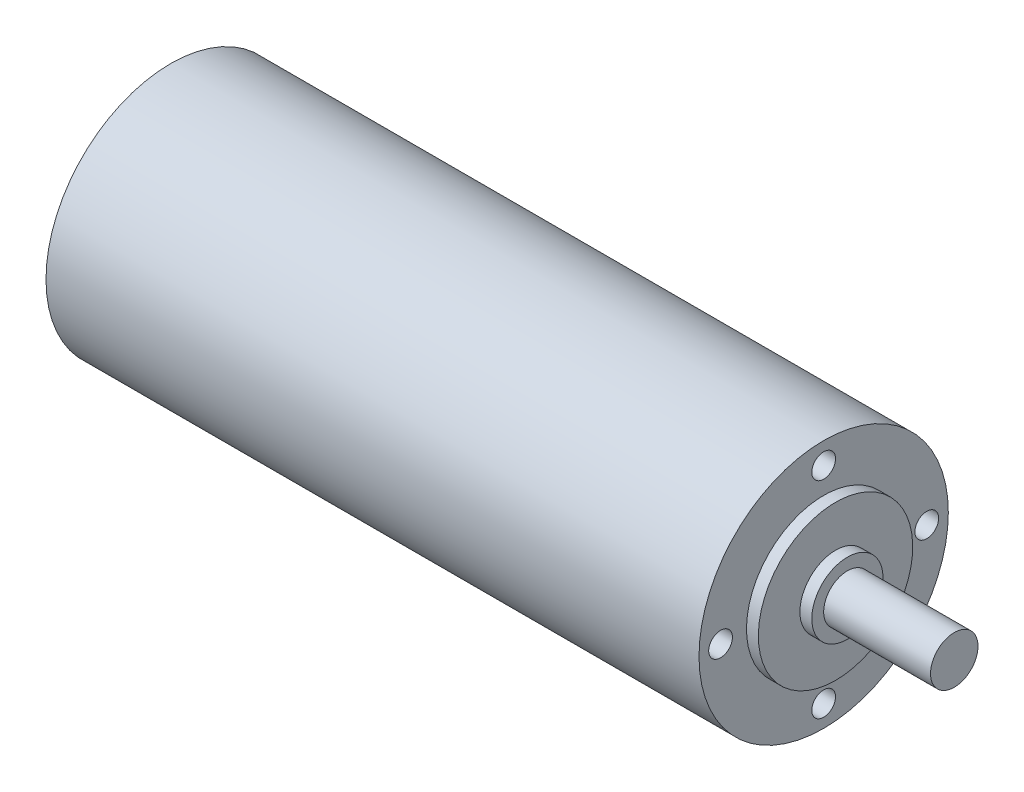
ISO-10303-21;
HEADER;
FILE_DESCRIPTION(('STEP AP214'),'2;1');
FILE_NAME('part.step','',(''),(''),'','','');
FILE_SCHEMA(('AUTOMOTIVE_DESIGN { 1 0 10303 214 1 1 1 1 }'));
ENDSEC;
DATA;
#1=APPLICATION_CONTEXT('core data for automotive mechanical design processes');
#2=APPLICATION_PROTOCOL_DEFINITION('international standard','automotive_design',2000,#1);
#3=PRODUCT_CONTEXT('',#1,'mechanical');
#4=PRODUCT('Part','Part','',(#3));
#5=PRODUCT_RELATED_PRODUCT_CATEGORY('part','',(#4));
#6=PRODUCT_DEFINITION_FORMATION('','',#4);
#7=PRODUCT_DEFINITION_CONTEXT('part definition',#1,'design');
#8=PRODUCT_DEFINITION('design','',#6,#7);
#9=PRODUCT_DEFINITION_SHAPE('','',#8);
#10=(LENGTH_UNIT() NAMED_UNIT(*) SI_UNIT(.MILLI.,.METRE.));
#11=(NAMED_UNIT(*) PLANE_ANGLE_UNIT() SI_UNIT($,.RADIAN.));
#12=(NAMED_UNIT(*) SI_UNIT($,.STERADIAN.) SOLID_ANGLE_UNIT());
#13=UNCERTAINTY_MEASURE_WITH_UNIT(LENGTH_MEASURE(1.E-05),#10,'distance_accuracy_value','');
#14=(GEOMETRIC_REPRESENTATION_CONTEXT(3) GLOBAL_UNCERTAINTY_ASSIGNED_CONTEXT((#13)) GLOBAL_UNIT_ASSIGNED_CONTEXT((#10,
#11,#12)) REPRESENTATION_CONTEXT('',''));
#15=CARTESIAN_POINT('',(0.,0.,0.));
#16=DIRECTION('',(0.,0.,1.));
#17=DIRECTION('',(1.,0.,0.));
#18=AXIS2_PLACEMENT_3D('',#15,#16,#17);
#19=CARTESIAN_POINT('',(0.,21.,0.));
#20=DIRECTION('',(1.,0.,0.));
#21=DIRECTION('',(0.,1.,0.));
#22=AXIS2_PLACEMENT_3D('',#19,#20,#21);
#23=PLANE('',#22);
#24=CARTESIAN_POINT('',(0.,0.,0.));
#25=DIRECTION('',(-1.,0.,0.));
#26=DIRECTION('',(0.,-1.,0.));
#27=AXIS2_PLACEMENT_3D('',#24,#25,#26);
#28=CIRCLE('',#27,21.);
#29=CARTESIAN_POINT('',(0.,-21.,0.));
#30=VERTEX_POINT('',#29);
#31=EDGE_CURVE('E76',#30,#30,#28,.T.);
#32=ORIENTED_EDGE('',*,*,#31,.T.);
#33=EDGE_LOOP('',(#32));
#34=FACE_BOUND('',#33,.T.);
#35=ADVANCED_FACE('F41',(#34),#23,.F.);
#36=CARTESIAN_POINT('',(132.,0.,0.));
#37=DIRECTION('',(-1.,0.,0.));
#38=DIRECTION('',(0.,-1.,0.));
#39=AXIS2_PLACEMENT_3D('',#36,#37,#38);
#40=PLANE('',#39);
#41=CARTESIAN_POINT('',(132.,0.,0.));
#42=DIRECTION('',(-1.,0.,0.));
#43=DIRECTION('',(0.,-1.,0.));
#44=AXIS2_PLACEMENT_3D('',#41,#42,#43);
#45=CIRCLE('',#44,4.);
#46=CARTESIAN_POINT('',(132.,-4.00000000000003,0.));
#47=VERTEX_POINT('',#46);
#48=EDGE_CURVE('E10',#47,#47,#45,.T.);
#49=ORIENTED_EDGE('',*,*,#48,.F.);
#50=EDGE_LOOP('',(#49));
#51=FACE_BOUND('',#50,.T.);
#52=ADVANCED_FACE('F162',(#51),#40,.F.);
#53=CARTESIAN_POINT('',(0.,0.,0.));
#54=DIRECTION('',(-1.,0.,0.));
#55=DIRECTION('',(0.,-1.,0.));
#56=AXIS2_PLACEMENT_3D('',#53,#54,#55);
#57=CYLINDRICAL_SURFACE('',#56,3.99999999999999);
#58=CARTESIAN_POINT('',(114.,0.,0.));
#59=DIRECTION('',(-1.,0.,0.));
#60=DIRECTION('',(0.,-1.,0.));
#61=AXIS2_PLACEMENT_3D('',#58,#59,#60);
#62=CIRCLE('',#61,3.99999999999997);
#63=CARTESIAN_POINT('',(114.,-4.,0.));
#64=VERTEX_POINT('',#63);
#65=EDGE_CURVE('E48',#64,#64,#62,.T.);
#66=ORIENTED_EDGE('',*,*,#65,.F.);
#67=EDGE_LOOP('',(#66));
#68=FACE_BOUND('',#67,.T.);
#69=ORIENTED_EDGE('',*,*,#48,.T.);
#70=EDGE_LOOP('',(#69));
#71=FACE_BOUND('',#70,.T.);
#72=ADVANCED_FACE('F157',(#68,#71),#57,.T.);
#73=CARTESIAN_POINT('',(114.,3.99999999999995,0.));
#74=DIRECTION('',(-1.,0.,0.));
#75=DIRECTION('',(0.,-1.,0.));
#76=AXIS2_PLACEMENT_3D('',#73,#74,#75);
#77=PLANE('',#76);
#78=CARTESIAN_POINT('',(114.,0.,0.));
#79=DIRECTION('',(-1.,0.,0.));
#80=DIRECTION('',(0.,-1.,0.));
#81=AXIS2_PLACEMENT_3D('',#78,#79,#80);
#82=CIRCLE('',#81,6.00000000000002);
#83=CARTESIAN_POINT('',(114.,-6.00000000000005,0.));
#84=VERTEX_POINT('',#83);
#85=EDGE_CURVE('E53',#84,#84,#82,.T.);
#86=ORIENTED_EDGE('',*,*,#85,.F.);
#87=EDGE_LOOP('',(#86));
#88=FACE_BOUND('',#87,.T.);
#89=ORIENTED_EDGE('',*,*,#65,.T.);
#90=EDGE_LOOP('',(#89));
#91=FACE_BOUND('',#90,.T.);
#92=ADVANCED_FACE('F152',(#88,#91),#77,.F.);
#93=CARTESIAN_POINT('',(0.,0.,0.));
#94=DIRECTION('',(-1.,0.,0.));
#95=DIRECTION('',(0.,-1.,0.));
#96=AXIS2_PLACEMENT_3D('',#93,#94,#95);
#97=CYLINDRICAL_SURFACE('',#96,6.00000000000002);
#98=CARTESIAN_POINT('',(112.,0.,0.));
#99=DIRECTION('',(-1.,0.,0.));
#100=DIRECTION('',(0.,-1.,0.));
#101=AXIS2_PLACEMENT_3D('',#98,#99,#100);
#102=CIRCLE('',#101,6.00000000000002);
#103=CARTESIAN_POINT('',(112.,-6.00000000000004,0.));
#104=VERTEX_POINT('',#103);
#105=EDGE_CURVE('E58',#104,#104,#102,.T.);
#106=ORIENTED_EDGE('',*,*,#105,.F.);
#107=EDGE_LOOP('',(#106));
#108=FACE_BOUND('',#107,.T.);
#109=ORIENTED_EDGE('',*,*,#85,.T.);
#110=EDGE_LOOP('',(#109));
#111=FACE_BOUND('',#110,.T.);
#112=ADVANCED_FACE('F146',(#108,#111),#97,.T.);
#113=CARTESIAN_POINT('',(112.,6.,0.));
#114=DIRECTION('',(-1.,0.,0.));
#115=DIRECTION('',(0.,-1.,0.));
#116=AXIS2_PLACEMENT_3D('',#113,#114,#115);
#117=PLANE('',#116);
#118=CARTESIAN_POINT('',(112.,0.,0.));
#119=DIRECTION('',(-1.,0.,0.));
#120=DIRECTION('',(0.,-1.,0.));
#121=AXIS2_PLACEMENT_3D('',#118,#119,#120);
#122=CIRCLE('',#121,13.);
#123=CARTESIAN_POINT('',(112.,-13.,0.));
#124=VERTEX_POINT('',#123);
#125=EDGE_CURVE('E64',#124,#124,#122,.T.);
#126=ORIENTED_EDGE('',*,*,#125,.F.);
#127=EDGE_LOOP('',(#126));
#128=FACE_BOUND('',#127,.T.);
#129=ORIENTED_EDGE('',*,*,#105,.T.);
#130=EDGE_LOOP('',(#129));
#131=FACE_BOUND('',#130,.T.);
#132=ADVANCED_FACE('F140',(#128,#131),#117,.F.);
#133=CARTESIAN_POINT('',(0.,0.,0.));
#134=DIRECTION('',(-1.,0.,0.));
#135=DIRECTION('',(0.,-1.,0.));
#136=AXIS2_PLACEMENT_3D('',#133,#134,#135);
#137=CYLINDRICAL_SURFACE('',#136,13.);
#138=CARTESIAN_POINT('',(110.,0.,0.));
#139=DIRECTION('',(-1.,0.,0.));
#140=DIRECTION('',(0.,-1.,0.));
#141=AXIS2_PLACEMENT_3D('',#138,#139,#140);
#142=CIRCLE('',#141,13.);
#143=CARTESIAN_POINT('',(110.,-13.,0.));
#144=VERTEX_POINT('',#143);
#145=EDGE_CURVE('E68',#144,#144,#142,.T.);
#146=ORIENTED_EDGE('',*,*,#145,.F.);
#147=EDGE_LOOP('',(#146));
#148=FACE_BOUND('',#147,.T.);
#149=ORIENTED_EDGE('',*,*,#125,.T.);
#150=EDGE_LOOP('',(#149));
#151=FACE_BOUND('',#150,.T.);
#152=ADVANCED_FACE('F126',(#148,#151),#137,.T.);
#153=CARTESIAN_POINT('',(110.,13.,0.));
#154=DIRECTION('',(-1.,0.,0.));
#155=DIRECTION('',(0.,-1.,0.));
#156=AXIS2_PLACEMENT_3D('',#153,#154,#155);
#157=PLANE('',#156);
#158=CARTESIAN_POINT('',(110.,17.365813997339,0.));
#159=DIRECTION('',(1.,0.,0.));
#160=DIRECTION('',(0.,1.,0.));
#161=AXIS2_PLACEMENT_3D('',#158,#159,#160);
#162=CIRCLE('',#161,2.);
#163=CARTESIAN_POINT('',(110.,19.365813997339,0.));
#164=VERTEX_POINT('',#163);
#165=EDGE_CURVE('E105',#164,#164,#162,.T.);
#166=ORIENTED_EDGE('',*,*,#165,.F.);
#167=EDGE_LOOP('',(#166));
#168=FACE_BOUND('',#167,.T.);
#169=CARTESIAN_POINT('',(110.,0.,-17.365813997339));
#170=DIRECTION('',(1.,0.,0.));
#171=DIRECTION('',(0.,1.,0.));
#172=AXIS2_PLACEMENT_3D('',#169,#170,#171);
#173=CIRCLE('',#172,2.);
#174=CARTESIAN_POINT('',(110.,1.99999999999998,-17.365813997339));
#175=VERTEX_POINT('',#174);
#176=EDGE_CURVE('E101',#175,#175,#173,.T.);
#177=ORIENTED_EDGE('',*,*,#176,.F.);
#178=EDGE_LOOP('',(#177));
#179=FACE_BOUND('',#178,.T.);
#180=CARTESIAN_POINT('',(110.,-17.365813997339,0.));
#181=DIRECTION('',(1.,0.,0.));
#182=DIRECTION('',(0.,1.,0.));
#183=AXIS2_PLACEMENT_3D('',#180,#181,#182);
#184=CIRCLE('',#183,2.);
#185=CARTESIAN_POINT('',(110.,-15.365813997339,0.));
#186=VERTEX_POINT('',#185);
#187=EDGE_CURVE('E93',#186,#186,#184,.T.);
#188=ORIENTED_EDGE('',*,*,#187,.F.);
#189=EDGE_LOOP('',(#188));
#190=FACE_BOUND('',#189,.T.);
#191=CARTESIAN_POINT('',(110.,0.,17.365813997339));
#192=DIRECTION('',(1.,0.,0.));
#193=DIRECTION('',(0.,1.,0.));
#194=AXIS2_PLACEMENT_3D('',#191,#192,#193);
#195=CIRCLE('',#194,2.);
#196=CARTESIAN_POINT('',(110.,1.99999999999997,17.365813997339));
#197=VERTEX_POINT('',#196);
#198=EDGE_CURVE('E85',#197,#197,#195,.T.);
#199=ORIENTED_EDGE('',*,*,#198,.F.);
#200=EDGE_LOOP('',(#199));
#201=FACE_BOUND('',#200,.T.);
#202=CARTESIAN_POINT('',(110.,0.,0.));
#203=DIRECTION('',(-1.,0.,0.));
#204=DIRECTION('',(0.,-1.,0.));
#205=AXIS2_PLACEMENT_3D('',#202,#203,#204);
#206=CIRCLE('',#205,21.);
#207=CARTESIAN_POINT('',(110.,-21.,0.));
#208=VERTEX_POINT('',#207);
#209=EDGE_CURVE('E72',#208,#208,#206,.T.);
#210=ORIENTED_EDGE('',*,*,#209,.F.);
#211=EDGE_LOOP('',(#210));
#212=FACE_BOUND('',#211,.T.);
#213=ORIENTED_EDGE('',*,*,#145,.T.);
#214=EDGE_LOOP('',(#213));
#215=FACE_BOUND('',#214,.T.);
#216=ADVANCED_FACE('F122',(#168,#179,#190,#201,#212,#215),#157,.F.);
#217=CARTESIAN_POINT('',(0.,0.,0.));
#218=DIRECTION('',(-1.,0.,0.));
#219=DIRECTION('',(0.,-1.,0.));
#220=AXIS2_PLACEMENT_3D('',#217,#218,#219);
#221=CYLINDRICAL_SURFACE('',#220,21.);
#222=ORIENTED_EDGE('',*,*,#31,.F.);
#223=EDGE_LOOP('',(#222));
#224=FACE_BOUND('',#223,.T.);
#225=ORIENTED_EDGE('',*,*,#209,.T.);
#226=EDGE_LOOP('',(#225));
#227=FACE_BOUND('',#226,.T.);
#228=ADVANCED_FACE('F125',(#224,#227),#221,.T.);
#229=CARTESIAN_POINT('',(100.,0.,17.365813997339));
#230=DIRECTION('',(1.,0.,0.));
#231=DIRECTION('',(0.,1.,0.));
#232=AXIS2_PLACEMENT_3D('',#229,#230,#231);
#233=CYLINDRICAL_SURFACE('',#232,2.);
#234=CARTESIAN_POINT('',(100.,0.,17.365813997339));
#235=DIRECTION('',(1.,0.,0.));
#236=DIRECTION('',(0.,1.,0.));
#237=AXIS2_PLACEMENT_3D('',#234,#235,#236);
#238=CIRCLE('',#237,2.);
#239=CARTESIAN_POINT('',(100.,1.99999999999998,17.365813997339));
#240=VERTEX_POINT('',#239);
#241=EDGE_CURVE('E81',#240,#240,#238,.T.);
#242=ORIENTED_EDGE('',*,*,#241,.F.);
#243=EDGE_LOOP('',(#242));
#244=FACE_BOUND('',#243,.T.);
#245=ORIENTED_EDGE('',*,*,#198,.T.);
#246=EDGE_LOOP('',(#245));
#247=FACE_BOUND('',#246,.T.);
#248=ADVANCED_FACE('F175',(#244,#247),#233,.F.);
#249=CARTESIAN_POINT('',(100.,0.,17.365813997339));
#250=DIRECTION('',(1.,0.,0.));
#251=DIRECTION('',(0.,1.,0.));
#252=AXIS2_PLACEMENT_3D('',#249,#250,#251);
#253=PLANE('',#252);
#254=ORIENTED_EDGE('',*,*,#241,.T.);
#255=EDGE_LOOP('',(#254));
#256=FACE_BOUND('',#255,.T.);
#257=ADVANCED_FACE('F180',(#256),#253,.T.);
#258=CARTESIAN_POINT('',(100.,-17.365813997339,0.));
#259=DIRECTION('',(1.,0.,0.));
#260=DIRECTION('',(0.,1.,0.));
#261=AXIS2_PLACEMENT_3D('',#258,#259,#260);
#262=CYLINDRICAL_SURFACE('',#261,2.);
#263=CARTESIAN_POINT('',(100.,-17.365813997339,0.));
#264=DIRECTION('',(1.,0.,0.));
#265=DIRECTION('',(0.,1.,0.));
#266=AXIS2_PLACEMENT_3D('',#263,#264,#265);
#267=CIRCLE('',#266,2.);
#268=CARTESIAN_POINT('',(100.,-15.365813997339,0.));
#269=VERTEX_POINT('',#268);
#270=EDGE_CURVE('E89',#269,#269,#267,.T.);
#271=ORIENTED_EDGE('',*,*,#270,.F.);
#272=EDGE_LOOP('',(#271));
#273=FACE_BOUND('',#272,.T.);
#274=ORIENTED_EDGE('',*,*,#187,.T.);
#275=EDGE_LOOP('',(#274));
#276=FACE_BOUND('',#275,.T.);
#277=ADVANCED_FACE('F185',(#273,#276),#262,.F.);
#278=CARTESIAN_POINT('',(100.,-17.365813997339,0.));
#279=DIRECTION('',(1.,0.,0.));
#280=DIRECTION('',(0.,1.,0.));
#281=AXIS2_PLACEMENT_3D('',#278,#279,#280);
#282=PLANE('',#281);
#283=ORIENTED_EDGE('',*,*,#270,.T.);
#284=EDGE_LOOP('',(#283));
#285=FACE_BOUND('',#284,.T.);
#286=ADVANCED_FACE('F188',(#285),#282,.T.);
#287=CARTESIAN_POINT('',(100.,0.,-17.365813997339));
#288=DIRECTION('',(1.,0.,0.));
#289=DIRECTION('',(0.,1.,0.));
#290=AXIS2_PLACEMENT_3D('',#287,#288,#289);
#291=CYLINDRICAL_SURFACE('',#290,2.);
#292=CARTESIAN_POINT('',(100.,0.,-17.365813997339));
#293=DIRECTION('',(1.,0.,0.));
#294=DIRECTION('',(0.,1.,0.));
#295=AXIS2_PLACEMENT_3D('',#292,#293,#294);
#296=CIRCLE('',#295,2.);
#297=CARTESIAN_POINT('',(100.,1.99999999999998,-17.365813997339));
#298=VERTEX_POINT('',#297);
#299=EDGE_CURVE('E97',#298,#298,#296,.T.);
#300=ORIENTED_EDGE('',*,*,#299,.F.);
#301=EDGE_LOOP('',(#300));
#302=FACE_BOUND('',#301,.T.);
#303=ORIENTED_EDGE('',*,*,#176,.T.);
#304=EDGE_LOOP('',(#303));
#305=FACE_BOUND('',#304,.T.);
#306=ADVANCED_FACE('F191',(#302,#305),#291,.F.);
#307=CARTESIAN_POINT('',(100.,0.,-17.365813997339));
#308=DIRECTION('',(1.,0.,0.));
#309=DIRECTION('',(0.,1.,0.));
#310=AXIS2_PLACEMENT_3D('',#307,#308,#309);
#311=PLANE('',#310);
#312=ORIENTED_EDGE('',*,*,#299,.T.);
#313=EDGE_LOOP('',(#312));
#314=FACE_BOUND('',#313,.T.);
#315=ADVANCED_FACE('F118',(#314),#311,.T.);
#316=CARTESIAN_POINT('',(100.,17.365813997339,0.));
#317=DIRECTION('',(1.,0.,0.));
#318=DIRECTION('',(0.,1.,0.));
#319=AXIS2_PLACEMENT_3D('',#316,#317,#318);
#320=CYLINDRICAL_SURFACE('',#319,2.);
#321=CARTESIAN_POINT('',(100.,17.365813997339,0.));
#322=DIRECTION('',(1.,0.,0.));
#323=DIRECTION('',(0.,1.,0.));
#324=AXIS2_PLACEMENT_3D('',#321,#322,#323);
#325=CIRCLE('',#324,2.);
#326=CARTESIAN_POINT('',(100.,19.365813997339,0.));
#327=VERTEX_POINT('',#326);
#328=EDGE_CURVE('E80',#327,#327,#325,.T.);
#329=ORIENTED_EDGE('',*,*,#328,.F.);
#330=EDGE_LOOP('',(#329));
#331=FACE_BOUND('',#330,.T.);
#332=ORIENTED_EDGE('',*,*,#165,.T.);
#333=EDGE_LOOP('',(#332));
#334=FACE_BOUND('',#333,.T.);
#335=ADVANCED_FACE('F115',(#331,#334),#320,.F.);
#336=CARTESIAN_POINT('',(100.,17.365813997339,0.));
#337=DIRECTION('',(1.,0.,0.));
#338=DIRECTION('',(0.,1.,0.));
#339=AXIS2_PLACEMENT_3D('',#336,#337,#338);
#340=PLANE('',#339);
#341=ORIENTED_EDGE('',*,*,#328,.T.);
#342=EDGE_LOOP('',(#341));
#343=FACE_BOUND('',#342,.T.);
#344=ADVANCED_FACE('F113',(#343),#340,.T.);
#345=CLOSED_SHELL('',(#35,#52,#72,#92,#112,#132,#152,#216,#228,#248,#257,#277,#286,#306,#315,
#335,#344));
#346=MANIFOLD_SOLID_BREP('B2',#345);
#347=ADVANCED_BREP_SHAPE_REPRESENTATION('',(#18,#346),#14);
#348=SHAPE_DEFINITION_REPRESENTATION(#9,#347);
ENDSEC;
END-ISO-10303-21;
